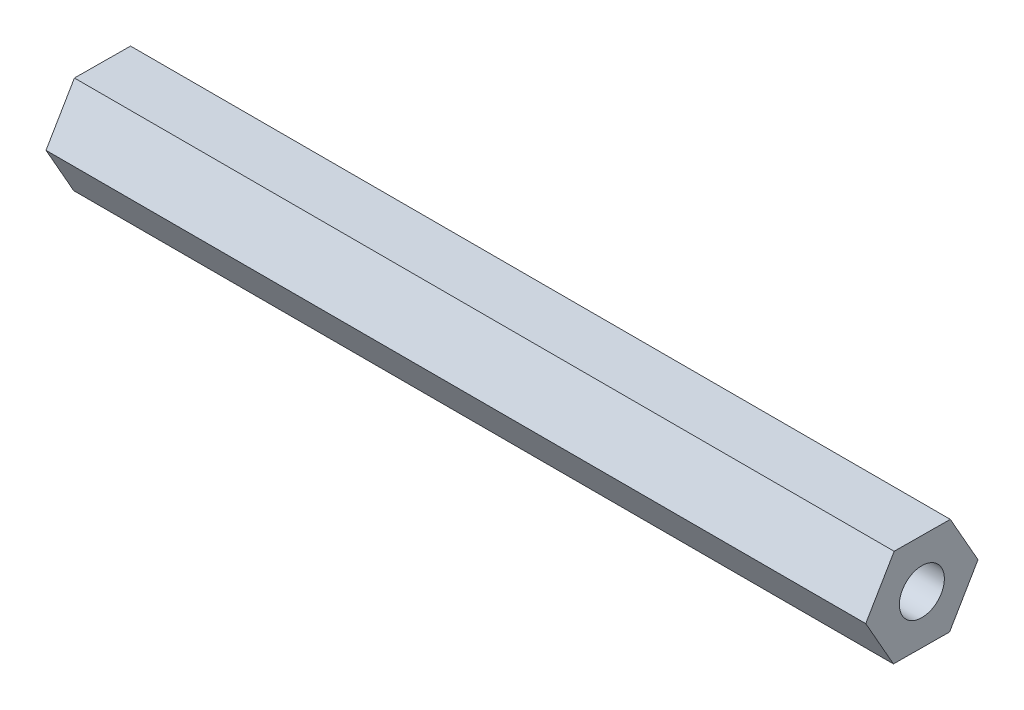
ISO-10303-21;
HEADER;
FILE_DESCRIPTION(('STEP AP214'),'2;1');
FILE_NAME('part.step','',(''),(''),'','','');
FILE_SCHEMA(('AUTOMOTIVE_DESIGN { 1 0 10303 214 1 1 1 1 }'));
ENDSEC;
DATA;
#1=APPLICATION_CONTEXT('core data for automotive mechanical design processes');
#2=APPLICATION_PROTOCOL_DEFINITION('international standard','automotive_design',2000,#1);
#3=PRODUCT_CONTEXT('',#1,'mechanical');
#4=PRODUCT('Part','Part','',(#3));
#5=PRODUCT_RELATED_PRODUCT_CATEGORY('part','',(#4));
#6=PRODUCT_DEFINITION_FORMATION('','',#4);
#7=PRODUCT_DEFINITION_CONTEXT('part definition',#1,'design');
#8=PRODUCT_DEFINITION('design','',#6,#7);
#9=PRODUCT_DEFINITION_SHAPE('','',#8);
#10=(LENGTH_UNIT() NAMED_UNIT(*) SI_UNIT(.MILLI.,.METRE.));
#11=(NAMED_UNIT(*) PLANE_ANGLE_UNIT() SI_UNIT($,.RADIAN.));
#12=(NAMED_UNIT(*) SI_UNIT($,.STERADIAN.) SOLID_ANGLE_UNIT());
#13=UNCERTAINTY_MEASURE_WITH_UNIT(LENGTH_MEASURE(1.E-05),#10,'distance_accuracy_value','');
#14=(GEOMETRIC_REPRESENTATION_CONTEXT(3) GLOBAL_UNCERTAINTY_ASSIGNED_CONTEXT((#13)) GLOBAL_UNIT_ASSIGNED_CONTEXT((#10,
#11,#12)) REPRESENTATION_CONTEXT('',''));
#15=CARTESIAN_POINT('',(0.,0.,0.));
#16=DIRECTION('',(0.,0.,1.));
#17=DIRECTION('',(1.,0.,0.));
#18=AXIS2_PLACEMENT_3D('',#15,#16,#17);
#19=CARTESIAN_POINT('',(59.,0.,0.));
#20=DIRECTION('',(1.,0.,0.));
#21=DIRECTION('',(0.,0.,-1.));
#22=AXIS2_PLACEMENT_3D('',#19,#20,#21);
#23=PLANE('',#22);
#24=DIRECTION('',(0.,-0.00723616790710349,-0.999973818594277));
#25=VECTOR('',#24,1.);
#26=CARTESIAN_POINT('',(59.,-3.48403397011643,2.04526460270419));
#27=LINE('',#26,#25);
#28=CARTESIAN_POINT('',(59.,-3.48403397011643,2.04526460270419));
#29=VERTEX_POINT('',#28);
#30=CARTESIAN_POINT('',(59.,-3.51326808846113,-1.99462962441669));
#31=VERTEX_POINT('',#30);
#32=EDGE_CURVE('E131',#29,#31,#27,.T.);
#33=ORIENTED_EDGE('',*,*,#32,.T.);
#34=DIRECTION('',(0.,0.862384646068424,-0.50625361453074));
#35=VECTOR('',#34,1.);
#36=CARTESIAN_POINT('',(59.,-3.51326808846113,-1.99462962441669));
#37=LINE('',#36,#35);
#38=CARTESIAN_POINT('',(59.,-0.0292341183447005,-4.03989422712088));
#39=VERTEX_POINT('',#38);
#40=EDGE_CURVE('E89',#31,#39,#37,.T.);
#41=ORIENTED_EDGE('',*,*,#40,.T.);
#42=DIRECTION('',(0.,0.869620813975528,0.493720204063537));
#43=VECTOR('',#42,1.);
#44=CARTESIAN_POINT('',(59.,-0.0292341183447005,-4.03989422712088));
#45=LINE('',#44,#43);
#46=CARTESIAN_POINT('',(59.,3.48403397011644,-2.04526460270419));
#47=VERTEX_POINT('',#46);
#48=EDGE_CURVE('E102',#39,#47,#45,.T.);
#49=ORIENTED_EDGE('',*,*,#48,.T.);
#50=DIRECTION('',(0.,0.00723616790710265,0.999973818594277));
#51=VECTOR('',#50,1.);
#52=CARTESIAN_POINT('',(59.,3.48403397011644,-2.04526460270419));
#53=LINE('',#52,#51);
#54=CARTESIAN_POINT('',(59.,3.51326808846113,1.99462962441669));
#55=VERTEX_POINT('',#54);
#56=EDGE_CURVE('E96',#47,#55,#53,.T.);
#57=ORIENTED_EDGE('',*,*,#56,.T.);
#58=DIRECTION('',(0.,-0.862384646068424,0.50625361453074));
#59=VECTOR('',#58,1.);
#60=CARTESIAN_POINT('',(59.,3.51326808846113,1.99462962441669));
#61=LINE('',#60,#59);
#62=CARTESIAN_POINT('',(59.,0.0292341183446942,4.03989422712088));
#63=VERTEX_POINT('',#62);
#64=EDGE_CURVE('E100',#55,#63,#61,.T.);
#65=ORIENTED_EDGE('',*,*,#64,.T.);
#66=DIRECTION('',(0.,-0.869620813975527,-0.493720204063537));
#67=VECTOR('',#66,1.);
#68=CARTESIAN_POINT('',(59.,0.0292341183446942,4.03989422712088));
#69=LINE('',#68,#67);
#70=EDGE_CURVE('E52',#63,#29,#69,.T.);
#71=ORIENTED_EDGE('',*,*,#70,.T.);
#72=EDGE_LOOP('',(#33,#41,#49,#57,#65,#71));
#73=FACE_BOUND('',#72,.T.);
#74=CARTESIAN_POINT('',(59.,0.,0.));
#75=DIRECTION('',(1.,0.,0.));
#76=DIRECTION('',(0.,0.,-1.));
#77=AXIS2_PLACEMENT_3D('',#74,#75,#76);
#78=CIRCLE('',#77,1.62);
#79=CARTESIAN_POINT('',(59.,0.,-1.62));
#80=VERTEX_POINT('',#79);
#81=EDGE_CURVE('E124',#80,#80,#78,.T.);
#82=ORIENTED_EDGE('',*,*,#81,.F.);
#83=EDGE_LOOP('',(#82));
#84=FACE_BOUND('',#83,.T.);
#85=ADVANCED_FACE('F35',(#73,#84),#23,.T.);
#86=CARTESIAN_POINT('',(0.,0.,0.));
#87=DIRECTION('',(1.,0.,0.));
#88=DIRECTION('',(0.,0.,-1.));
#89=AXIS2_PLACEMENT_3D('',#86,#87,#88);
#90=PLANE('',#89);
#91=DIRECTION('',(0.,-0.00723616790710349,-0.999973818594277));
#92=VECTOR('',#91,1.);
#93=CARTESIAN_POINT('',(0.,-3.48403397011643,2.04526460270419));
#94=LINE('',#93,#92);
#95=CARTESIAN_POINT('',(0.,-3.48403397011643,2.04526460270419));
#96=VERTEX_POINT('',#95);
#97=CARTESIAN_POINT('',(0.,-3.51326808846113,-1.99462962441669));
#98=VERTEX_POINT('',#97);
#99=EDGE_CURVE('E120',#96,#98,#94,.T.);
#100=ORIENTED_EDGE('',*,*,#99,.F.);
#101=DIRECTION('',(0.,-0.869620813975527,-0.493720204063537));
#102=VECTOR('',#101,1.);
#103=CARTESIAN_POINT('',(0.,0.0292341183446942,4.03989422712088));
#104=LINE('',#103,#102);
#105=CARTESIAN_POINT('',(0.,0.0292341183446942,4.03989422712088));
#106=VERTEX_POINT('',#105);
#107=EDGE_CURVE('E81',#106,#96,#104,.T.);
#108=ORIENTED_EDGE('',*,*,#107,.F.);
#109=DIRECTION('',(0.,-0.862384646068424,0.50625361453074));
#110=VECTOR('',#109,1.);
#111=CARTESIAN_POINT('',(0.,3.51326808846113,1.99462962441669));
#112=LINE('',#111,#110);
#113=CARTESIAN_POINT('',(0.,3.51326808846113,1.99462962441669));
#114=VERTEX_POINT('',#113);
#115=EDGE_CURVE('E75',#114,#106,#112,.T.);
#116=ORIENTED_EDGE('',*,*,#115,.F.);
#117=DIRECTION('',(0.,0.00723616790710265,0.999973818594277));
#118=VECTOR('',#117,1.);
#119=CARTESIAN_POINT('',(0.,3.48403397011644,-2.04526460270419));
#120=LINE('',#119,#118);
#121=CARTESIAN_POINT('',(0.,3.48403397011644,-2.04526460270419));
#122=VERTEX_POINT('',#121);
#123=EDGE_CURVE('E110',#122,#114,#120,.T.);
#124=ORIENTED_EDGE('',*,*,#123,.F.);
#125=DIRECTION('',(0.,0.869620813975528,0.493720204063537));
#126=VECTOR('',#125,1.);
#127=CARTESIAN_POINT('',(0.,-0.0292341183447005,-4.03989422712088));
#128=LINE('',#127,#126);
#129=CARTESIAN_POINT('',(0.,-0.0292341183447005,-4.03989422712088));
#130=VERTEX_POINT('',#129);
#131=EDGE_CURVE('E126',#130,#122,#128,.T.);
#132=ORIENTED_EDGE('',*,*,#131,.F.);
#133=DIRECTION('',(0.,0.862384646068424,-0.50625361453074));
#134=VECTOR('',#133,1.);
#135=CARTESIAN_POINT('',(0.,-3.51326808846113,-1.99462962441669));
#136=LINE('',#135,#134);
#137=EDGE_CURVE('E123',#98,#130,#136,.T.);
#138=ORIENTED_EDGE('',*,*,#137,.F.);
#139=EDGE_LOOP('',(#100,#108,#116,#124,#132,#138));
#140=FACE_BOUND('',#139,.T.);
#141=CARTESIAN_POINT('',(0.,0.,0.));
#142=DIRECTION('',(1.,0.,0.));
#143=DIRECTION('',(0.,0.,-1.));
#144=AXIS2_PLACEMENT_3D('',#141,#142,#143);
#145=CIRCLE('',#144,1.62);
#146=CARTESIAN_POINT('',(0.,0.,-1.62));
#147=VERTEX_POINT('',#146);
#148=EDGE_CURVE('E224',#147,#147,#145,.T.);
#149=ORIENTED_EDGE('',*,*,#148,.T.);
#150=EDGE_LOOP('',(#149));
#151=FACE_BOUND('',#150,.T.);
#152=ADVANCED_FACE('F140',(#140,#151),#90,.F.);
#153=CARTESIAN_POINT('',(59.,-3.48403397011643,2.04526460270419));
#154=DIRECTION('',(0.,0.999973818594277,-0.00723616790710349));
#155=DIRECTION('',(0.,0.00723616790710349,0.999973818594277));
#156=AXIS2_PLACEMENT_3D('',#153,#154,#155);
#157=PLANE('',#156);
#158=ORIENTED_EDGE('',*,*,#99,.T.);
#159=DIRECTION('',(-1.,0.,0.));
#160=VECTOR('',#159,1.);
#161=CARTESIAN_POINT('',(59.,-3.51326808846113,-1.99462962441669));
#162=LINE('',#161,#160);
#163=EDGE_CURVE('E11',#31,#98,#162,.T.);
#164=ORIENTED_EDGE('',*,*,#163,.F.);
#165=ORIENTED_EDGE('',*,*,#32,.F.);
#166=DIRECTION('',(-1.,0.,0.));
#167=VECTOR('',#166,1.);
#168=CARTESIAN_POINT('',(59.,-3.48403397011643,2.04526460270419));
#169=LINE('',#168,#167);
#170=EDGE_CURVE('E116',#29,#96,#169,.T.);
#171=ORIENTED_EDGE('',*,*,#170,.T.);
#172=EDGE_LOOP('',(#158,#164,#165,#171));
#173=FACE_BOUND('',#172,.T.);
#174=ADVANCED_FACE('F37',(#173),#157,.F.);
#175=CARTESIAN_POINT('',(59.,-3.51326808846113,-1.99462962441669));
#176=DIRECTION('',(0.,0.50625361453074,0.862384646068424));
#177=DIRECTION('',(0.,-0.862384646068424,0.50625361453074));
#178=AXIS2_PLACEMENT_3D('',#175,#176,#177);
#179=PLANE('',#178);
#180=ORIENTED_EDGE('',*,*,#137,.T.);
#181=DIRECTION('',(-1.,0.,0.));
#182=VECTOR('',#181,1.);
#183=CARTESIAN_POINT('',(59.,-0.0292341183447005,-4.03989422712088));
#184=LINE('',#183,#182);
#185=EDGE_CURVE('E44',#39,#130,#184,.T.);
#186=ORIENTED_EDGE('',*,*,#185,.F.);
#187=ORIENTED_EDGE('',*,*,#40,.F.);
#188=ORIENTED_EDGE('',*,*,#163,.T.);
#189=EDGE_LOOP('',(#180,#186,#187,#188));
#190=FACE_BOUND('',#189,.T.);
#191=ADVANCED_FACE('F165',(#190),#179,.F.);
#192=CARTESIAN_POINT('',(59.,-0.0292341183447005,-4.03989422712088));
#193=DIRECTION('',(0.,-0.493720204063537,0.869620813975528));
#194=DIRECTION('',(0.,-0.869620813975528,-0.493720204063537));
#195=AXIS2_PLACEMENT_3D('',#192,#193,#194);
#196=PLANE('',#195);
#197=ORIENTED_EDGE('',*,*,#131,.T.);
#198=DIRECTION('',(-1.,0.,0.));
#199=VECTOR('',#198,1.);
#200=CARTESIAN_POINT('',(59.,3.48403397011644,-2.04526460270419));
#201=LINE('',#200,#199);
#202=EDGE_CURVE('E111',#47,#122,#201,.T.);
#203=ORIENTED_EDGE('',*,*,#202,.F.);
#204=ORIENTED_EDGE('',*,*,#48,.F.);
#205=ORIENTED_EDGE('',*,*,#185,.T.);
#206=EDGE_LOOP('',(#197,#203,#204,#205));
#207=FACE_BOUND('',#206,.T.);
#208=ADVANCED_FACE('F137',(#207),#196,.F.);
#209=CARTESIAN_POINT('',(59.,3.48403397011644,-2.04526460270419));
#210=DIRECTION('',(0.,-0.999973818594277,0.00723616790710265));
#211=DIRECTION('',(0.,-0.00723616790710265,-0.999973818594277));
#212=AXIS2_PLACEMENT_3D('',#209,#210,#211);
#213=PLANE('',#212);
#214=ORIENTED_EDGE('',*,*,#123,.T.);
#215=DIRECTION('',(-1.,0.,0.));
#216=VECTOR('',#215,1.);
#217=CARTESIAN_POINT('',(59.,3.51326808846113,1.99462962441669));
#218=LINE('',#217,#216);
#219=EDGE_CURVE('E107',#55,#114,#218,.T.);
#220=ORIENTED_EDGE('',*,*,#219,.F.);
#221=ORIENTED_EDGE('',*,*,#56,.F.);
#222=ORIENTED_EDGE('',*,*,#202,.T.);
#223=EDGE_LOOP('',(#214,#220,#221,#222));
#224=FACE_BOUND('',#223,.T.);
#225=ADVANCED_FACE('F108',(#224),#213,.F.);
#226=CARTESIAN_POINT('',(59.,3.51326808846113,1.99462962441669));
#227=DIRECTION('',(0.,-0.50625361453074,-0.862384646068424));
#228=DIRECTION('',(0.,0.862384646068424,-0.50625361453074));
#229=AXIS2_PLACEMENT_3D('',#226,#227,#228);
#230=PLANE('',#229);
#231=ORIENTED_EDGE('',*,*,#115,.T.);
#232=DIRECTION('',(-1.,0.,0.));
#233=VECTOR('',#232,1.);
#234=CARTESIAN_POINT('',(59.,0.0292341183446942,4.03989422712088));
#235=LINE('',#234,#233);
#236=EDGE_CURVE('E112',#63,#106,#235,.T.);
#237=ORIENTED_EDGE('',*,*,#236,.F.);
#238=ORIENTED_EDGE('',*,*,#64,.F.);
#239=ORIENTED_EDGE('',*,*,#219,.T.);
#240=EDGE_LOOP('',(#231,#237,#238,#239));
#241=FACE_BOUND('',#240,.T.);
#242=ADVANCED_FACE('F114',(#241),#230,.F.);
#243=CARTESIAN_POINT('',(59.,0.0292341183446942,4.03989422712088));
#244=DIRECTION('',(0.,0.493720204063537,-0.869620813975528));
#245=DIRECTION('',(0.,0.869620813975528,0.493720204063537));
#246=AXIS2_PLACEMENT_3D('',#243,#244,#245);
#247=PLANE('',#246);
#248=ORIENTED_EDGE('',*,*,#107,.T.);
#249=ORIENTED_EDGE('',*,*,#170,.F.);
#250=ORIENTED_EDGE('',*,*,#70,.F.);
#251=ORIENTED_EDGE('',*,*,#236,.T.);
#252=EDGE_LOOP('',(#248,#249,#250,#251));
#253=FACE_BOUND('',#252,.T.);
#254=ADVANCED_FACE('F145',(#253),#247,.F.);
#255=CARTESIAN_POINT('',(59.,0.,0.));
#256=DIRECTION('',(-1.,0.,0.));
#257=DIRECTION('',(0.,0.,1.));
#258=AXIS2_PLACEMENT_3D('',#255,#256,#257);
#259=CYLINDRICAL_SURFACE('',#258,1.62);
#260=ORIENTED_EDGE('',*,*,#81,.T.);
#261=EDGE_LOOP('',(#260));
#262=FACE_BOUND('',#261,.T.);
#263=ORIENTED_EDGE('',*,*,#148,.F.);
#264=EDGE_LOOP('',(#263));
#265=FACE_BOUND('',#264,.T.);
#266=ADVANCED_FACE('F147',(#262,#265),#259,.F.);
#267=CLOSED_SHELL('',(#85,#152,#174,#191,#208,#225,#242,#254,#266));
#268=MANIFOLD_SOLID_BREP('B2',#267);
#269=ADVANCED_BREP_SHAPE_REPRESENTATION('',(#18,#268),#14);
#270=SHAPE_DEFINITION_REPRESENTATION(#9,#269);
ENDSEC;
END-ISO-10303-21;
